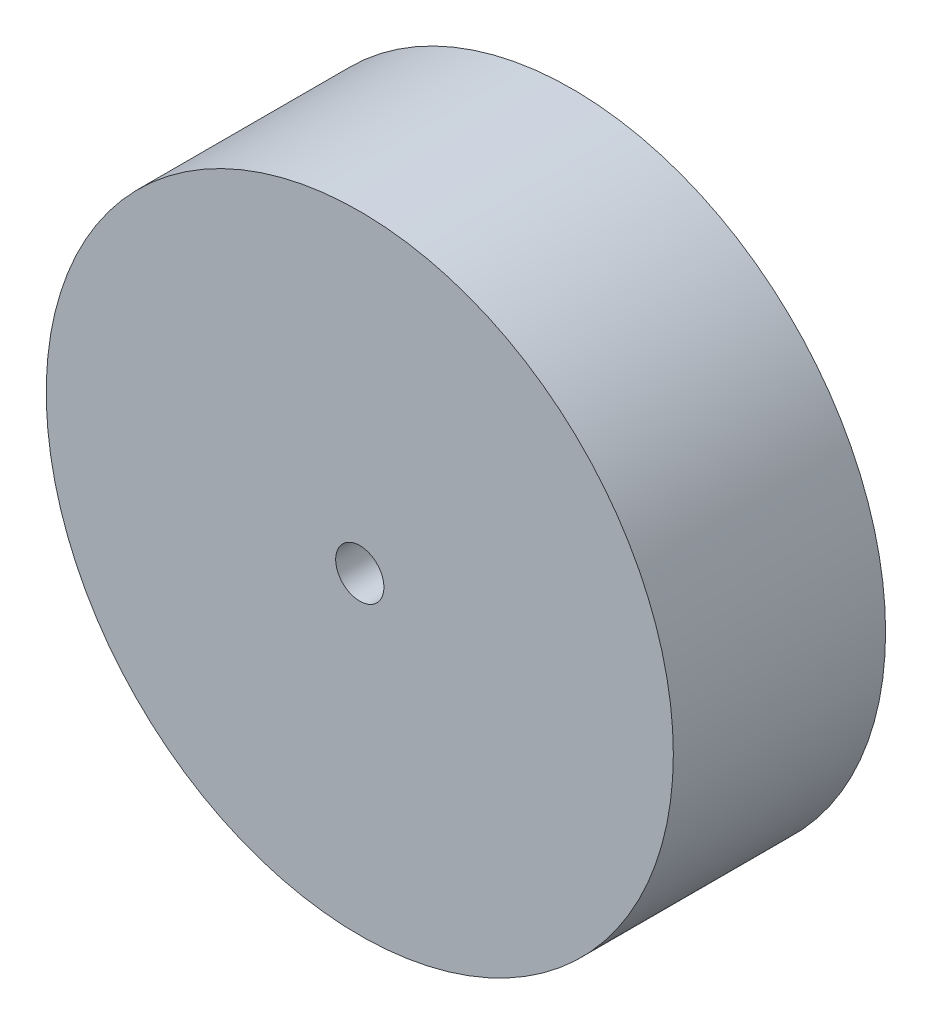
ISO-10303-21;
HEADER;
FILE_DESCRIPTION(('STEP AP214'),'2;1');
FILE_NAME('part.step','',(''),(''),'','','');
FILE_SCHEMA(('AUTOMOTIVE_DESIGN { 1 0 10303 214 1 1 1 1 }'));
ENDSEC;
DATA;
#1=APPLICATION_CONTEXT('core data for automotive mechanical design processes');
#2=APPLICATION_PROTOCOL_DEFINITION('international standard','automotive_design',2000,#1);
#3=PRODUCT_CONTEXT('',#1,'mechanical');
#4=PRODUCT('Part','Part','',(#3));
#5=PRODUCT_RELATED_PRODUCT_CATEGORY('part','',(#4));
#6=PRODUCT_DEFINITION_FORMATION('','',#4);
#7=PRODUCT_DEFINITION_CONTEXT('part definition',#1,'design');
#8=PRODUCT_DEFINITION('design','',#6,#7);
#9=PRODUCT_DEFINITION_SHAPE('','',#8);
#10=(LENGTH_UNIT() NAMED_UNIT(*) SI_UNIT(.MILLI.,.METRE.));
#11=(NAMED_UNIT(*) PLANE_ANGLE_UNIT() SI_UNIT($,.RADIAN.));
#12=(NAMED_UNIT(*) SI_UNIT($,.STERADIAN.) SOLID_ANGLE_UNIT());
#13=UNCERTAINTY_MEASURE_WITH_UNIT(LENGTH_MEASURE(1.E-05),#10,'distance_accuracy_value','');
#14=(GEOMETRIC_REPRESENTATION_CONTEXT(3) GLOBAL_UNCERTAINTY_ASSIGNED_CONTEXT((#13)) GLOBAL_UNIT_ASSIGNED_CONTEXT((#10,
#11,#12)) REPRESENTATION_CONTEXT('',''));
#15=CARTESIAN_POINT('',(0.,0.,0.));
#16=DIRECTION('',(0.,0.,1.));
#17=DIRECTION('',(1.,0.,0.));
#18=AXIS2_PLACEMENT_3D('',#15,#16,#17);
#19=CARTESIAN_POINT('',(0.,0.,22.));
#20=DIRECTION('',(0.,0.,1.));
#21=DIRECTION('',(1.,0.,0.));
#22=AXIS2_PLACEMENT_3D('',#19,#20,#21);
#23=PLANE('',#22);
#24=CARTESIAN_POINT('',(0.,0.,22.));
#25=DIRECTION('',(0.,0.,1.));
#26=DIRECTION('',(1.,0.,0.));
#27=AXIS2_PLACEMENT_3D('',#24,#25,#26);
#28=CIRCLE('',#27,32.5);
#29=CARTESIAN_POINT('',(32.5,0.,22.));
#30=VERTEX_POINT('',#29);
#31=EDGE_CURVE('E10',#30,#30,#28,.T.);
#32=ORIENTED_EDGE('',*,*,#31,.T.);
#33=EDGE_LOOP('',(#32));
#34=FACE_BOUND('',#33,.T.);
#35=CARTESIAN_POINT('',(0.,0.,22.));
#36=DIRECTION('',(0.,0.,1.));
#37=DIRECTION('',(1.,0.,0.));
#38=AXIS2_PLACEMENT_3D('',#35,#36,#37);
#39=CIRCLE('',#38,2.5);
#40=CARTESIAN_POINT('',(2.5,0.,22.));
#41=VERTEX_POINT('',#40);
#42=EDGE_CURVE('E42',#41,#41,#39,.T.);
#43=ORIENTED_EDGE('',*,*,#42,.F.);
#44=EDGE_LOOP('',(#43));
#45=FACE_BOUND('',#44,.T.);
#46=ADVANCED_FACE('F31',(#34,#45),#23,.T.);
#47=CARTESIAN_POINT('',(0.,0.,0.));
#48=DIRECTION('',(0.,0.,1.));
#49=DIRECTION('',(1.,0.,0.));
#50=AXIS2_PLACEMENT_3D('',#47,#48,#49);
#51=PLANE('',#50);
#52=CARTESIAN_POINT('',(0.,0.,0.));
#53=DIRECTION('',(0.,0.,1.));
#54=DIRECTION('',(1.,0.,0.));
#55=AXIS2_PLACEMENT_3D('',#52,#53,#54);
#56=CIRCLE('',#55,32.5);
#57=CARTESIAN_POINT('',(32.5,0.,0.));
#58=VERTEX_POINT('',#57);
#59=EDGE_CURVE('E35',#58,#58,#56,.T.);
#60=ORIENTED_EDGE('',*,*,#59,.F.);
#61=EDGE_LOOP('',(#60));
#62=FACE_BOUND('',#61,.T.);
#63=CARTESIAN_POINT('',(0.,0.,0.));
#64=DIRECTION('',(0.,0.,1.));
#65=DIRECTION('',(1.,0.,0.));
#66=AXIS2_PLACEMENT_3D('',#63,#64,#65);
#67=CIRCLE('',#66,2.5);
#68=CARTESIAN_POINT('',(2.5,0.,0.));
#69=VERTEX_POINT('',#68);
#70=EDGE_CURVE('E44',#69,#69,#67,.T.);
#71=ORIENTED_EDGE('',*,*,#70,.T.);
#72=EDGE_LOOP('',(#71));
#73=FACE_BOUND('',#72,.T.);
#74=ADVANCED_FACE('F54',(#62,#73),#51,.F.);
#75=CARTESIAN_POINT('',(0.,0.,22.));
#76=DIRECTION('',(0.,0.,-1.));
#77=DIRECTION('',(-1.,0.,0.));
#78=AXIS2_PLACEMENT_3D('',#75,#76,#77);
#79=CYLINDRICAL_SURFACE('',#78,32.5);
#80=ORIENTED_EDGE('',*,*,#31,.F.);
#81=EDGE_LOOP('',(#80));
#82=FACE_BOUND('',#81,.T.);
#83=ORIENTED_EDGE('',*,*,#59,.T.);
#84=EDGE_LOOP('',(#83));
#85=FACE_BOUND('',#84,.T.);
#86=ADVANCED_FACE('F33',(#82,#85),#79,.T.);
#87=CARTESIAN_POINT('',(0.,0.,22.));
#88=DIRECTION('',(0.,0.,-1.));
#89=DIRECTION('',(-1.,0.,0.));
#90=AXIS2_PLACEMENT_3D('',#87,#88,#89);
#91=CYLINDRICAL_SURFACE('',#90,2.5);
#92=ORIENTED_EDGE('',*,*,#42,.T.);
#93=EDGE_LOOP('',(#92));
#94=FACE_BOUND('',#93,.T.);
#95=ORIENTED_EDGE('',*,*,#70,.F.);
#96=EDGE_LOOP('',(#95));
#97=FACE_BOUND('',#96,.T.);
#98=ADVANCED_FACE('F50',(#94,#97),#91,.F.);
#99=CLOSED_SHELL('',(#46,#74,#86,#98));
#100=MANIFOLD_SOLID_BREP('B2',#99);
#101=ADVANCED_BREP_SHAPE_REPRESENTATION('',(#18,#100),#14);
#102=SHAPE_DEFINITION_REPRESENTATION(#9,#101);
ENDSEC;
END-ISO-10303-21;
